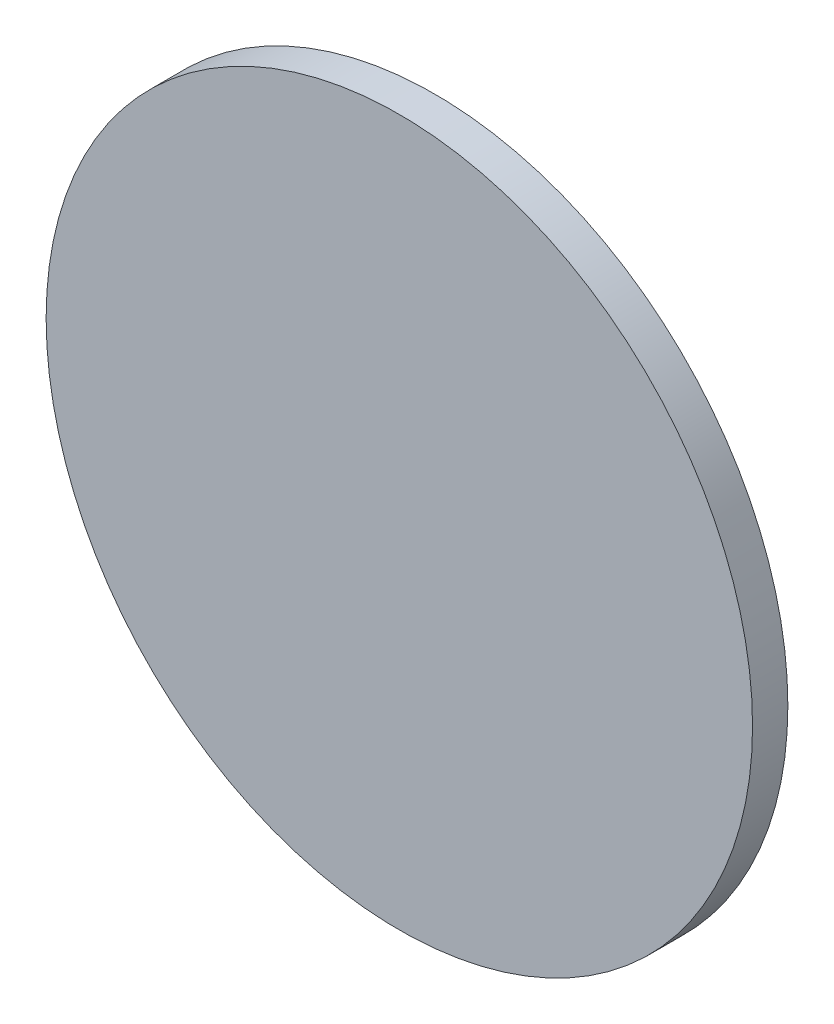
ISO-10303-21;
HEADER;
FILE_DESCRIPTION(('STEP AP214'),'2;1');
FILE_NAME('part.step','',(''),(''),'','','');
FILE_SCHEMA(('AUTOMOTIVE_DESIGN { 1 0 10303 214 1 1 1 1 }'));
ENDSEC;
DATA;
#1=APPLICATION_CONTEXT('core data for automotive mechanical design processes');
#2=APPLICATION_PROTOCOL_DEFINITION('international standard','automotive_design',2000,#1);
#3=PRODUCT_CONTEXT('',#1,'mechanical');
#4=PRODUCT('Part','Part','',(#3));
#5=PRODUCT_RELATED_PRODUCT_CATEGORY('part','',(#4));
#6=PRODUCT_DEFINITION_FORMATION('','',#4);
#7=PRODUCT_DEFINITION_CONTEXT('part definition',#1,'design');
#8=PRODUCT_DEFINITION('design','',#6,#7);
#9=PRODUCT_DEFINITION_SHAPE('','',#8);
#10=(LENGTH_UNIT() NAMED_UNIT(*) SI_UNIT(.MILLI.,.METRE.));
#11=(NAMED_UNIT(*) PLANE_ANGLE_UNIT() SI_UNIT($,.RADIAN.));
#12=(NAMED_UNIT(*) SI_UNIT($,.STERADIAN.) SOLID_ANGLE_UNIT());
#13=UNCERTAINTY_MEASURE_WITH_UNIT(LENGTH_MEASURE(1.E-05),#10,'distance_accuracy_value','');
#14=(GEOMETRIC_REPRESENTATION_CONTEXT(3) GLOBAL_UNCERTAINTY_ASSIGNED_CONTEXT((#13)) GLOBAL_UNIT_ASSIGNED_CONTEXT((#10,
#11,#12)) REPRESENTATION_CONTEXT('',''));
#15=CARTESIAN_POINT('',(0.,0.,0.));
#16=DIRECTION('',(0.,0.,1.));
#17=DIRECTION('',(1.,0.,0.));
#18=AXIS2_PLACEMENT_3D('',#15,#16,#17);
#19=CARTESIAN_POINT('',(0.,0.,3.175));
#20=DIRECTION('',(0.,0.,-1.));
#21=DIRECTION('',(-1.,0.,0.));
#22=AXIS2_PLACEMENT_3D('',#19,#20,#21);
#23=CYLINDRICAL_SURFACE('',#22,31.75);
#24=CARTESIAN_POINT('',(0.,0.,3.175));
#25=DIRECTION('',(0.,0.,1.));
#26=DIRECTION('',(1.,0.,0.));
#27=AXIS2_PLACEMENT_3D('',#24,#25,#26);
#28=CIRCLE('',#27,31.75);
#29=CARTESIAN_POINT('',(31.75,0.,3.175));
#30=VERTEX_POINT('',#29);
#31=EDGE_CURVE('E10',#30,#30,#28,.T.);
#32=ORIENTED_EDGE('',*,*,#31,.F.);
#33=EDGE_LOOP('',(#32));
#34=FACE_BOUND('',#33,.T.);
#35=CARTESIAN_POINT('',(0.,0.,0.));
#36=DIRECTION('',(0.,0.,1.));
#37=DIRECTION('',(1.,0.,0.));
#38=AXIS2_PLACEMENT_3D('',#35,#36,#37);
#39=CIRCLE('',#38,31.75);
#40=CARTESIAN_POINT('',(31.75,0.,0.));
#41=VERTEX_POINT('',#40);
#42=EDGE_CURVE('E34',#41,#41,#39,.T.);
#43=ORIENTED_EDGE('',*,*,#42,.T.);
#44=EDGE_LOOP('',(#43));
#45=FACE_BOUND('',#44,.T.);
#46=ADVANCED_FACE('F31',(#34,#45),#23,.T.);
#47=CARTESIAN_POINT('',(0.,0.,3.175));
#48=DIRECTION('',(0.,0.,1.));
#49=DIRECTION('',(1.,0.,0.));
#50=AXIS2_PLACEMENT_3D('',#47,#48,#49);
#51=PLANE('',#50);
#52=ORIENTED_EDGE('',*,*,#31,.T.);
#53=EDGE_LOOP('',(#52));
#54=FACE_BOUND('',#53,.T.);
#55=ADVANCED_FACE('F46',(#54),#51,.T.);
#56=CARTESIAN_POINT('',(0.,0.,0.));
#57=DIRECTION('',(0.,0.,1.));
#58=DIRECTION('',(1.,0.,0.));
#59=AXIS2_PLACEMENT_3D('',#56,#57,#58);
#60=PLANE('',#59);
#61=ORIENTED_EDGE('',*,*,#42,.F.);
#62=EDGE_LOOP('',(#61));
#63=FACE_BOUND('',#62,.T.);
#64=ADVANCED_FACE('F44',(#63),#60,.F.);
#65=CLOSED_SHELL('',(#46,#55,#64));
#66=MANIFOLD_SOLID_BREP('B2',#65);
#67=ADVANCED_BREP_SHAPE_REPRESENTATION('',(#18,#66),#14);
#68=SHAPE_DEFINITION_REPRESENTATION(#9,#67);
ENDSEC;
END-ISO-10303-21;
